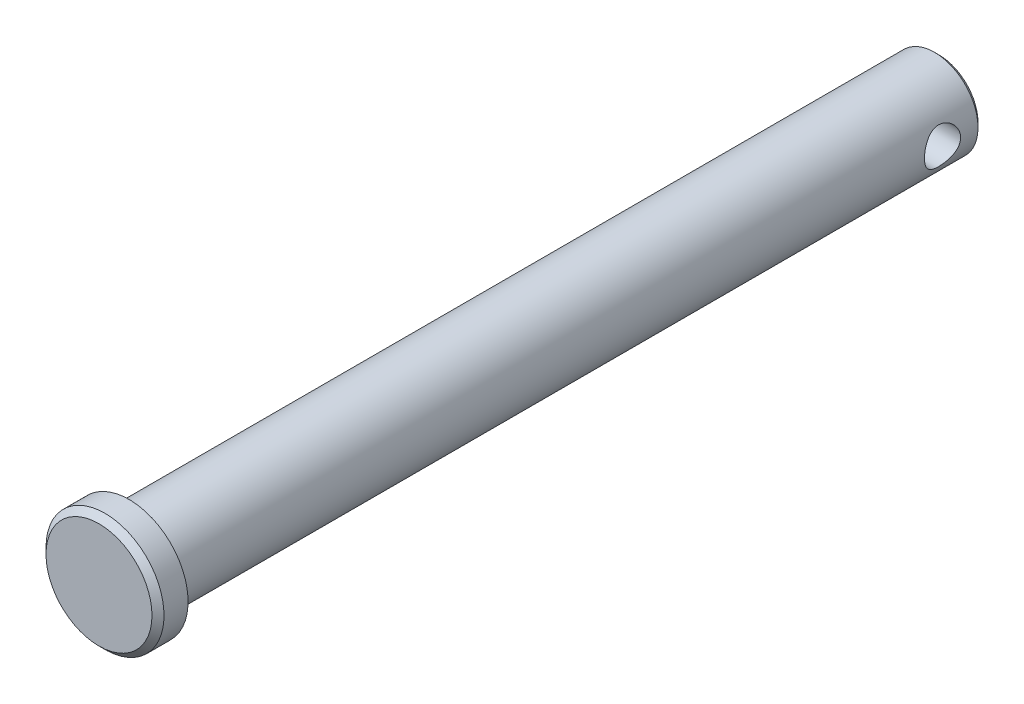
ISO-10303-21;
HEADER;
FILE_DESCRIPTION(('STEP AP214'),'2;1');
FILE_NAME('part.step','',(''),(''),'','','');
FILE_SCHEMA(('AUTOMOTIVE_DESIGN { 1 0 10303 214 1 1 1 1 }'));
ENDSEC;
DATA;
#1=APPLICATION_CONTEXT('core data for automotive mechanical design processes');
#2=APPLICATION_PROTOCOL_DEFINITION('international standard','automotive_design',2000,#1);
#3=PRODUCT_CONTEXT('',#1,'mechanical');
#4=PRODUCT('Part','Part','',(#3));
#5=PRODUCT_RELATED_PRODUCT_CATEGORY('part','',(#4));
#6=PRODUCT_DEFINITION_FORMATION('','',#4);
#7=PRODUCT_DEFINITION_CONTEXT('part definition',#1,'design');
#8=PRODUCT_DEFINITION('design','',#6,#7);
#9=PRODUCT_DEFINITION_SHAPE('','',#8);
#10=(LENGTH_UNIT() NAMED_UNIT(*) SI_UNIT(.MILLI.,.METRE.));
#11=(NAMED_UNIT(*) PLANE_ANGLE_UNIT() SI_UNIT($,.RADIAN.));
#12=(NAMED_UNIT(*) SI_UNIT($,.STERADIAN.) SOLID_ANGLE_UNIT());
#13=UNCERTAINTY_MEASURE_WITH_UNIT(LENGTH_MEASURE(1.E-05),#10,'distance_accuracy_value','');
#14=(GEOMETRIC_REPRESENTATION_CONTEXT(3) GLOBAL_UNCERTAINTY_ASSIGNED_CONTEXT((#13)) GLOBAL_UNIT_ASSIGNED_CONTEXT((#10,
#11,#12)) REPRESENTATION_CONTEXT('',''));
#15=CARTESIAN_POINT('',(0.,0.,0.));
#16=DIRECTION('',(0.,0.,1.));
#17=DIRECTION('',(1.,0.,0.));
#18=AXIS2_PLACEMENT_3D('',#15,#16,#17);
#19=CARTESIAN_POINT('',(0.,0.,44.45));
#20=DIRECTION('',(0.,0.,-1.));
#21=DIRECTION('',(-1.,0.,0.));
#22=AXIS2_PLACEMENT_3D('',#19,#20,#21);
#23=CYLINDRICAL_SURFACE('',#22,4.7625);
#24=CARTESIAN_POINT('',(0.,0.,-43.97375));
#25=DIRECTION('',(0.,0.,1.));
#26=DIRECTION('',(1.,0.,0.));
#27=AXIS2_PLACEMENT_3D('',#24,#25,#26);
#28=CIRCLE('',#27,4.7625);
#29=CARTESIAN_POINT('',(4.7625,0.,-43.97375));
#30=VERTEX_POINT('',#29);
#31=EDGE_CURVE('E40',#30,#30,#28,.T.);
#32=ORIENTED_EDGE('',*,*,#31,.T.);
#33=EDGE_LOOP('',(#32));
#34=FACE_BOUND('',#33,.T.);
#35=CARTESIAN_POINT('',(-4.7625,0.,-38.1));
#36=CARTESIAN_POINT('',(-4.76249140158045,-0.106295908560073,-38.1000114380824));
#37=CARTESIAN_POINT('',(-4.75890007347352,-0.212758967838845,-38.1085914841634));
#38=CARTESIAN_POINT('',(-4.74488118807538,-0.422667701710699,-38.1426070155608));
#39=CARTESIAN_POINT('',(-4.73443579242881,-0.526104765072408,-38.168086485087));
#40=CARTESIAN_POINT('',(-4.70783108848027,-0.726580864674278,-38.2347963582017));
#41=CARTESIAN_POINT('',(-4.69169114960318,-0.823640282526702,-38.2759734057807));
#42=CARTESIAN_POINT('',(-4.65526892272179,-1.00937973872919,-38.3726893568817));
#43=CARTESIAN_POINT('',(-4.63498788984898,-1.0980623041503,-38.4282239101163));
#44=CARTESIAN_POINT('',(-4.59117427508592,-1.26912434065072,-38.555023509863));
#45=CARTESIAN_POINT('',(-4.56753520905172,-1.35102801218446,-38.6268933277037));
#46=CARTESIAN_POINT('',(-4.52013183583765,-1.50202871598238,-38.7830446314673));
#47=CARTESIAN_POINT('',(-4.4963674694456,-1.57111900525552,-38.86733261077));
#48=CARTESIAN_POINT('',(-4.4500962212813,-1.69789058594091,-39.0509550093843));
#49=CARTESIAN_POINT('',(-4.42770874161498,-1.75484326694355,-39.1508256993771));
#50=CARTESIAN_POINT('',(-4.38841471116746,-1.85092880684824,-39.3597975469495));
#51=CARTESIAN_POINT('',(-4.37150533813807,-1.89007084577611,-39.4688939149316));
#52=CARTESIAN_POINT('',(-4.34623456677982,-1.94745924820552,-39.6877439856816));
#53=CARTESIAN_POINT('',(-4.33750065397212,-1.96662131880699,-39.7972128923851));
#54=CARTESIAN_POINT('',(-4.32849855373462,-1.98636270823876,-40.0181338521399));
#55=CARTESIAN_POINT('',(-4.328225697501,-1.98695227536355,-40.1295847775409));
#56=CARTESIAN_POINT('',(-4.33586127302854,-1.97022164952332,-40.3421850959405));
#57=CARTESIAN_POINT('',(-4.34314413823751,-1.95427093765777,-40.4434692407961));
#58=CARTESIAN_POINT('',(-4.36401341403402,-1.90720965737545,-40.6417654444631));
#59=CARTESIAN_POINT('',(-4.37760103179408,-1.87609618568393,-40.7387766812432));
#60=CARTESIAN_POINT('',(-4.40985568326751,-1.79898609480018,-40.9282228534989));
#61=CARTESIAN_POINT('',(-4.42862465094254,-1.75268686068537,-41.0205164807));
#62=CARTESIAN_POINT('',(-4.46910350686474,-1.64673347596642,-41.1963834025347));
#63=CARTESIAN_POINT('',(-4.49081455356025,-1.58707405869977,-41.279953239099));
#64=CARTESIAN_POINT('',(-4.53696350793792,-1.45017484530084,-41.4434336844884));
#65=CARTESIAN_POINT('',(-4.561476802296,-1.37187540459195,-41.5224381757244));
#66=CARTESIAN_POINT('',(-4.6089200606614,-1.20289572579427,-41.6664989359477));
#67=CARTESIAN_POINT('',(-4.63184965292253,-1.11221259562442,-41.7315519375613));
#68=CARTESIAN_POINT('',(-4.67420775145901,-0.918286118550733,-41.8471918699908));
#69=CARTESIAN_POINT('',(-4.69354323137542,-0.814801174635689,-41.8974102441767));
#70=CARTESIAN_POINT('',(-4.72582051746,-0.59984068901134,-41.9794073091202));
#71=CARTESIAN_POINT('',(-4.73876585655208,-0.488369601737113,-42.0111961907108));
#72=CARTESIAN_POINT('',(-4.75614430383386,-0.268173379937133,-42.053535387501));
#73=CARTESIAN_POINT('',(-4.76106396412311,-0.159720415379836,-42.065301723692));
#74=CARTESIAN_POINT('',(-4.76338979960382,0.0577130156000446,-42.0708871299874));
#75=CARTESIAN_POINT('',(-4.76079813192703,0.166693321604812,-42.064711352775));
#76=CARTESIAN_POINT('',(-4.74870808030392,0.37639345971703,-42.0354584028704));
#77=CARTESIAN_POINT('',(-4.73955883563333,0.477254834540027,-42.0132351978707));
#78=CARTESIAN_POINT('',(-4.71564663251208,0.673707613991607,-41.9537067411665));
#79=CARTESIAN_POINT('',(-4.70088296486029,0.769298351097898,-41.9163995840539));
#80=CARTESIAN_POINT('',(-4.666587546492,0.955848037292255,-41.826543576057));
#81=CARTESIAN_POINT('',(-4.64692192707484,1.04657086350783,-41.7735572592557));
#82=CARTESIAN_POINT('',(-4.60492164769306,1.21816211826739,-41.6543277627557));
#83=CARTESIAN_POINT('',(-4.58258587495364,1.29902640975558,-41.5880790481973));
#84=CARTESIAN_POINT('',(-4.53567939534007,1.45467932056039,-41.4386661171801));
#85=CARTESIAN_POINT('',(-4.51106304400759,1.52862073304299,-41.3546313765093));
#86=CARTESIAN_POINT('',(-4.46380134619208,1.66158838069249,-41.1749537244526));
#87=CARTESIAN_POINT('',(-4.44115644808334,1.72061122865917,-41.0793081841649));
#88=CARTESIAN_POINT('',(-4.40025450662331,1.8227033683131,-40.8771499967072));
#89=CARTESIAN_POINT('',(-4.3820645555624,1.86553345201759,-40.7705019686202));
#90=CARTESIAN_POINT('',(-4.35305764608595,1.93226394648122,-40.5505116823265));
#91=CARTESIAN_POINT('',(-4.34223460919756,1.95617996596104,-40.4371750270577));
#92=CARTESIAN_POINT('',(-4.33011523702907,1.98285227553879,-40.2164253150213));
#93=CARTESIAN_POINT('',(-4.32814969660371,1.98709566405842,-40.1092278486105));
#94=CARTESIAN_POINT('',(-4.33218991655001,1.9782722614421,-39.8957119579385));
#95=CARTESIAN_POINT('',(-4.33819445320237,1.96520812768995,-39.789393401252));
#96=CARTESIAN_POINT('',(-4.3568866269235,1.92338967589029,-39.5857527633931));
#97=CARTESIAN_POINT('',(-4.36925013318788,1.89539409419702,-39.4882422808769));
#98=CARTESIAN_POINT('',(-4.39901300153713,1.82524921020888,-39.2992800160954));
#99=CARTESIAN_POINT('',(-4.41641377846563,1.78309593083637,-39.2078299449294));
#100=CARTESIAN_POINT('',(-4.45558790364021,1.68291328922589,-39.0275827651808));
#101=CARTESIAN_POINT('',(-4.47756125557966,1.62408172945392,-38.9392758008578));
#102=CARTESIAN_POINT('',(-4.5228460637297,1.49333596530074,-38.7733220287649));
#103=CARTESIAN_POINT('',(-4.54615798199076,1.42141722463767,-38.6956789337341));
#104=CARTESIAN_POINT('',(-4.59353273649544,1.26031949767388,-38.5474389678255));
#105=CARTESIAN_POINT('',(-4.61752660299969,1.17026489966908,-38.4777671628655));
#106=CARTESIAN_POINT('',(-4.66185477999957,0.978852625814453,-38.3544771174995));
#107=CARTESIAN_POINT('',(-4.68218742117825,0.877489827988869,-38.3008661926128));
#108=CARTESIAN_POINT('',(-4.71660828587906,0.667912140039742,-38.2123793703642));
#109=CARTESIAN_POINT('',(-4.73079417348867,0.559838210681756,-38.177208432995));
#110=CARTESIAN_POINT('',(-4.75172103007692,0.33878904468141,-38.1258662025889));
#111=CARTESIAN_POINT('',(-4.75848530476497,0.225830315707268,-38.1096354224838));
#112=CARTESIAN_POINT('',(-4.76206006515682,0.074987280046702,-38.1010586067753));
#113=CARTESIAN_POINT('',(-4.76250303375275,0.0375040440476048,-38.0999959643381));
#114=CARTESIAN_POINT('',(-4.7625,0.,-38.1));
#115=B_SPLINE_CURVE_WITH_KNOTS('',3,(#35,#36,#37,#38,#39,#40,#41,#42,#43,#44,#45,#46,#47,#48,
#49,#50,#51,#52,#53,#54,#55,#56,#57,#58,#59,#60,#61,#62,#63,#64,#65,#66,#67,#68,#69,#70,#71,#72,
#73,#74,#75,#76,#77,#78,#79,#80,#81,#82,#83,#84,#85,#86,#87,#88,#89,#90,#91,#92,#93,#94,#95,#96,
#97,#98,#99,#100,#101,#102,#103,#104,#105,#106,#107,#108,#109,#110,#111,#112,#113,#114),
.UNSPECIFIED.,.T.,.F.,(4,2,2,2,2,2,2,2,2,2,2,2,2,2,2,2,2,2,2,2,2,2,2,2,2,2,2,2,2,2,2,2,2,2,2,2,
2,2,2,4),(0.,0.318780983728251,0.638394933248055,0.956932064901255,1.2753727935041,
1.60842223858481,1.94164645533701,2.2912661270586,2.64070539184808,2.97331246105872,
3.30573599470361,3.61267624559059,3.9196752906695,4.23320706980709,4.54686266326065,
4.88702574040535,5.22726839536908,5.57536437409041,5.92326768446546,6.24916903886785,
6.5749768089541,6.88461586205457,7.19429404105333,7.51359202244555,7.83302353682824,
8.17528349746504,8.51762109719041,8.86483476520742,9.21176159730895,9.53198305625933,
9.85215535434837,10.1574226931906,10.462775857341,10.7864893076844,11.1103151781368,
11.4577262432026,11.8052953096787,12.1471190861327,12.4878663512005,12.6003408219232),.UNSPECIFIED.);
#116=CARTESIAN_POINT('',(-4.7625,0.,-38.1));
#117=VERTEX_POINT('',#116);
#118=EDGE_CURVE('E51',#117,#117,#115,.T.);
#119=ORIENTED_EDGE('',*,*,#118,.T.);
#120=EDGE_LOOP('',(#119));
#121=FACE_BOUND('',#120,.T.);
#122=CARTESIAN_POINT('',(4.7625,0.,-42.06875));
#123=CARTESIAN_POINT('',(4.76249140158045,-0.106295908560074,-42.0687385619176));
#124=CARTESIAN_POINT('',(4.75890007347352,-0.212758967838847,-42.0601585158366));
#125=CARTESIAN_POINT('',(4.74488118807538,-0.4226677017107,-42.0261429844392));
#126=CARTESIAN_POINT('',(4.73443579242881,-0.526104765072408,-42.000663514913));
#127=CARTESIAN_POINT('',(4.70783108848027,-0.726580864674276,-41.9339536417983));
#128=CARTESIAN_POINT('',(4.69169114960318,-0.8236402825267,-41.8927765942193));
#129=CARTESIAN_POINT('',(4.65526892272179,-1.00937973872918,-41.7960606431183));
#130=CARTESIAN_POINT('',(4.63498788984898,-1.0980623041503,-41.7405260898838));
#131=CARTESIAN_POINT('',(4.59117427508592,-1.26912434065072,-41.613726490137));
#132=CARTESIAN_POINT('',(4.56753520905172,-1.35102801218446,-41.5418566722963));
#133=CARTESIAN_POINT('',(4.52013183583765,-1.50202871598238,-41.3857053685327));
#134=CARTESIAN_POINT('',(4.4963674694456,-1.57111900525552,-41.30141738923));
#135=CARTESIAN_POINT('',(4.4500962212813,-1.69789058594091,-41.1177949906157));
#136=CARTESIAN_POINT('',(4.42770874161498,-1.75484326694355,-41.0179243006229));
#137=CARTESIAN_POINT('',(4.38841471116746,-1.85092880684824,-40.8089524530505));
#138=CARTESIAN_POINT('',(4.37150533813807,-1.89007084577611,-40.6998560850684));
#139=CARTESIAN_POINT('',(4.34623456677982,-1.94745924820552,-40.4810060143184));
#140=CARTESIAN_POINT('',(4.33750065397212,-1.96662131880698,-40.371537107615));
#141=CARTESIAN_POINT('',(4.32849855373462,-1.98636270823876,-40.1506161478601));
#142=CARTESIAN_POINT('',(4.328225697501,-1.98695227536355,-40.0391652224591));
#143=CARTESIAN_POINT('',(4.33586127302854,-1.97022164952332,-39.8265649040595));
#144=CARTESIAN_POINT('',(4.34314413823751,-1.95427093765777,-39.7252807592039));
#145=CARTESIAN_POINT('',(4.36401341403402,-1.90720965737545,-39.5269845555369));
#146=CARTESIAN_POINT('',(4.37760103179408,-1.87609618568393,-39.4299733187568));
#147=CARTESIAN_POINT('',(4.40985568326751,-1.79898609480018,-39.2405271465011));
#148=CARTESIAN_POINT('',(4.42862465094254,-1.75268686068537,-39.1482335193));
#149=CARTESIAN_POINT('',(4.46910350686474,-1.64673347596642,-38.9723665974653));
#150=CARTESIAN_POINT('',(4.49081455356025,-1.58707405869977,-38.888796760901));
#151=CARTESIAN_POINT('',(4.53696350793792,-1.45017484530084,-38.7253163155116));
#152=CARTESIAN_POINT('',(4.561476802296,-1.37187540459195,-38.6463118242756));
#153=CARTESIAN_POINT('',(4.6089200606614,-1.20289572579427,-38.5022510640523));
#154=CARTESIAN_POINT('',(4.63184965292253,-1.11221259562442,-38.4371980624387));
#155=CARTESIAN_POINT('',(4.67420775145901,-0.918286118550733,-38.3215581300092));
#156=CARTESIAN_POINT('',(4.69354323137542,-0.814801174635689,-38.2713397558233));
#157=CARTESIAN_POINT('',(4.72582051746,-0.599840689011341,-38.1893426908798));
#158=CARTESIAN_POINT('',(4.73876585655208,-0.488369601737113,-38.1575538092892));
#159=CARTESIAN_POINT('',(4.75614430383386,-0.268173379937133,-38.115214612499));
#160=CARTESIAN_POINT('',(4.76106396412311,-0.159720415379836,-38.1034482763081));
#161=CARTESIAN_POINT('',(4.76338979960382,0.0577130156000439,-38.0978628700126));
#162=CARTESIAN_POINT('',(4.76079813192703,0.166693321604811,-38.104038647225));
#163=CARTESIAN_POINT('',(4.74870808030392,0.376393459717029,-38.1332915971296));
#164=CARTESIAN_POINT('',(4.73955883563333,0.477254834540026,-38.1555148021293));
#165=CARTESIAN_POINT('',(4.71564663251208,0.673707613991606,-38.2150432588335));
#166=CARTESIAN_POINT('',(4.7008829648603,0.769298351097898,-38.2523504159461));
#167=CARTESIAN_POINT('',(4.666587546492,0.955848037292255,-38.342206423943));
#168=CARTESIAN_POINT('',(4.64692192707484,1.04657086350783,-38.3951927407443));
#169=CARTESIAN_POINT('',(4.60492164769306,1.21816211826739,-38.5144222372443));
#170=CARTESIAN_POINT('',(4.58258587495364,1.29902640975558,-38.5806709518027));
#171=CARTESIAN_POINT('',(4.53567939534007,1.45467932056039,-38.73008388282));
#172=CARTESIAN_POINT('',(4.51106304400759,1.52862073304299,-38.8141186234907));
#173=CARTESIAN_POINT('',(4.46380134619208,1.66158838069249,-38.9937962755475));
#174=CARTESIAN_POINT('',(4.44115644808334,1.72061122865917,-39.0894418158351));
#175=CARTESIAN_POINT('',(4.40025450662331,1.8227033683131,-39.2916000032928));
#176=CARTESIAN_POINT('',(4.3820645555624,1.86553345201759,-39.3982480313798));
#177=CARTESIAN_POINT('',(4.35305764608595,1.93226394648122,-39.6182383176735));
#178=CARTESIAN_POINT('',(4.34223460919756,1.95617996596104,-39.7315749729423));
#179=CARTESIAN_POINT('',(4.33011523702907,1.98285227553879,-39.9523246849787));
#180=CARTESIAN_POINT('',(4.32814969660371,1.98709566405842,-40.0595221513895));
#181=CARTESIAN_POINT('',(4.33218991655001,1.9782722614421,-40.2730380420615));
#182=CARTESIAN_POINT('',(4.33819445320237,1.96520812768995,-40.379356598748));
#183=CARTESIAN_POINT('',(4.3568866269235,1.92338967589029,-40.5829972366069));
#184=CARTESIAN_POINT('',(4.36925013318788,1.89539409419702,-40.6805077191231));
#185=CARTESIAN_POINT('',(4.39901300153713,1.82524921020888,-40.8694699839046));
#186=CARTESIAN_POINT('',(4.41641377846563,1.78309593083637,-40.9609200550706));
#187=CARTESIAN_POINT('',(4.45558790364021,1.68291328922589,-41.1411672348192));
#188=CARTESIAN_POINT('',(4.47756125557966,1.62408172945392,-41.2294741991422));
#189=CARTESIAN_POINT('',(4.5228460637297,1.49333596530074,-41.3954279712351));
#190=CARTESIAN_POINT('',(4.54615798199076,1.42141722463767,-41.4730710662659));
#191=CARTESIAN_POINT('',(4.59353273649544,1.26031949767387,-41.6213110321745));
#192=CARTESIAN_POINT('',(4.61752660299969,1.17026489966908,-41.6909828371345));
#193=CARTESIAN_POINT('',(4.66185477999957,0.978852625814449,-41.8142728825005));
#194=CARTESIAN_POINT('',(4.68218742117825,0.877489827988869,-41.8678838073872));
#195=CARTESIAN_POINT('',(4.71660828587906,0.667912140039744,-41.9563706296358));
#196=CARTESIAN_POINT('',(4.73079417348868,0.559838210681756,-41.991541567005));
#197=CARTESIAN_POINT('',(4.75172103007692,0.338789044681409,-42.0428837974111));
#198=CARTESIAN_POINT('',(4.75848530476497,0.225830315707268,-42.0591145775162));
#199=CARTESIAN_POINT('',(4.76206006515682,0.0749872800467027,-42.0676913932247));
#200=CARTESIAN_POINT('',(4.76250303375275,0.0375040440476052,-42.0687540356619));
#201=CARTESIAN_POINT('',(4.7625,0.,-42.06875));
#202=B_SPLINE_CURVE_WITH_KNOTS('',3,(#122,#123,#124,#125,#126,#127,#128,#129,#130,#131,#132,
#133,#134,#135,#136,#137,#138,#139,#140,#141,#142,#143,#144,#145,#146,#147,#148,#149,#150,#151,
#152,#153,#154,#155,#156,#157,#158,#159,#160,#161,#162,#163,#164,#165,#166,#167,#168,#169,#170,
#171,#172,#173,#174,#175,#176,#177,#178,#179,#180,#181,#182,#183,#184,#185,#186,#187,#188,#189,
#190,#191,#192,#193,#194,#195,#196,#197,#198,#199,#200,#201),.UNSPECIFIED.,.T.,.F.,(4,2,2,2,2,2,
2,2,2,2,2,2,2,2,2,2,2,2,2,2,2,2,2,2,2,2,2,2,2,2,2,2,2,2,2,2,2,2,2,4),(0.,0.318780983728252,
0.638394933248055,0.956932064901252,1.2753727935041,1.60842223858481,1.94164645533701,
2.2912661270586,2.64070539184808,2.97331246105871,3.3057359947036,3.61267624559059,
3.9196752906695,4.23320706980709,4.54686266326065,4.88702574040535,5.22726839536908,
5.57536437409041,5.92326768446546,6.24916903886785,6.57497680895409,6.88461586205457,
7.19429404105333,7.51359202244555,7.83302353682824,8.17528349746504,8.51762109719041,
8.86483476520742,9.21176159730895,9.53198305625933,9.85215535434837,10.1574226931906,
10.462775857341,10.7864893076844,11.1103151781368,11.4577262432026,11.8052953096787,
12.1471190861327,12.4878663512005,12.6003408219232),.UNSPECIFIED.);
#203=CARTESIAN_POINT('',(4.7625,0.,-42.06875));
#204=VERTEX_POINT('',#203);
#205=EDGE_CURVE('E59',#204,#204,#202,.T.);
#206=ORIENTED_EDGE('',*,*,#205,.T.);
#207=EDGE_LOOP('',(#206));
#208=FACE_BOUND('',#207,.T.);
#209=CARTESIAN_POINT('',(0.,0.,44.45));
#210=DIRECTION('',(0.,0.,1.));
#211=DIRECTION('',(1.,0.,0.));
#212=AXIS2_PLACEMENT_3D('',#209,#210,#211);
#213=CIRCLE('',#212,4.7625);
#214=CARTESIAN_POINT('',(4.7625,0.,44.45));
#215=VERTEX_POINT('',#214);
#216=EDGE_CURVE('E97',#215,#215,#213,.T.);
#217=ORIENTED_EDGE('',*,*,#216,.F.);
#218=EDGE_LOOP('',(#217));
#219=FACE_BOUND('',#218,.T.);
#220=ADVANCED_FACE('F33',(#34,#121,#208,#219),#23,.T.);
#221=CARTESIAN_POINT('',(0.,0.,-44.45));
#222=DIRECTION('',(0.,0.,1.));
#223=DIRECTION('',(1.,0.,0.));
#224=AXIS2_PLACEMENT_3D('',#221,#222,#223);
#225=PLANE('',#224);
#226=CARTESIAN_POINT('',(0.,0.,-44.45));
#227=DIRECTION('',(0.,0.,1.));
#228=DIRECTION('',(1.,0.,0.));
#229=AXIS2_PLACEMENT_3D('',#226,#227,#228);
#230=CIRCLE('',#229,4.28625000000004);
#231=CARTESIAN_POINT('',(4.28625000000004,0.,-44.45));
#232=VERTEX_POINT('',#231);
#233=EDGE_CURVE('E10',#232,#232,#230,.F.);
#234=ORIENTED_EDGE('',*,*,#233,.T.);
#235=EDGE_LOOP('',(#234));
#236=FACE_BOUND('',#235,.T.);
#237=ADVANCED_FACE('F79',(#236),#225,.F.);
#238=CARTESIAN_POINT('',(0.,0.,44.45));
#239=DIRECTION('',(0.,0.,1.));
#240=DIRECTION('',(1.,0.,0.));
#241=AXIS2_PLACEMENT_3D('',#238,#239,#240);
#242=PLANE('',#241);
#243=CARTESIAN_POINT('',(0.,0.,44.45));
#244=DIRECTION('',(0.,0.,1.));
#245=DIRECTION('',(1.,0.,0.));
#246=AXIS2_PLACEMENT_3D('',#243,#244,#245);
#247=CIRCLE('',#246,6.477);
#248=CARTESIAN_POINT('',(-6.477,0.,44.45));
#249=VERTEX_POINT('',#248);
#250=EDGE_CURVE('E58',#249,#249,#247,.T.);
#251=ORIENTED_EDGE('',*,*,#250,.F.);
#252=EDGE_LOOP('',(#251));
#253=FACE_BOUND('',#252,.T.);
#254=ORIENTED_EDGE('',*,*,#216,.T.);
#255=EDGE_LOOP('',(#254));
#256=FACE_BOUND('',#255,.T.);
#257=ADVANCED_FACE('F76',(#253,#256),#242,.F.);
#258=CARTESIAN_POINT('',(0.,0.,47.752));
#259=DIRECTION('',(0.,0.,-1.));
#260=DIRECTION('',(-1.,0.,0.));
#261=AXIS2_PLACEMENT_3D('',#258,#259,#260);
#262=CYLINDRICAL_SURFACE('',#261,6.477);
#263=CARTESIAN_POINT('',(0.,0.,47.0916));
#264=DIRECTION('',(0.,0.,1.));
#265=DIRECTION('',(1.,0.,0.));
#266=AXIS2_PLACEMENT_3D('',#263,#264,#265);
#267=CIRCLE('',#266,6.477);
#268=CARTESIAN_POINT('',(-6.477,0.,47.0916));
#269=VERTEX_POINT('',#268);
#270=EDGE_CURVE('E44',#269,#269,#267,.F.);
#271=CARTESIAN_POINT('',(-6.477,0.,47.0916));
#272=CARTESIAN_POINT('',(-6.477,0.,47.0640833333334));
#273=CARTESIAN_POINT('',(-6.477,0.,47.0365666666667));
#274=CARTESIAN_POINT('',(-6.477,0.,46.9815333333334));
#275=CARTESIAN_POINT('',(-6.477,0.,46.9540166666667));
#276=CARTESIAN_POINT('',(-6.477,0.,46.8989833333334));
#277=CARTESIAN_POINT('',(-6.477,0.,46.8714666666667));
#278=CARTESIAN_POINT('',(-6.477,0.,46.8164333333334));
#279=CARTESIAN_POINT('',(-6.477,0.,46.7889166666667));
#280=CARTESIAN_POINT('',(-6.477,0.,46.7338833333334));
#281=CARTESIAN_POINT('',(-6.477,0.,46.7063666666667));
#282=CARTESIAN_POINT('',(-6.477,0.,46.6513333333334));
#283=CARTESIAN_POINT('',(-6.477,0.,46.6238166666667));
#284=CARTESIAN_POINT('',(-6.477,0.,46.5687833333334));
#285=CARTESIAN_POINT('',(-6.477,0.,46.5412666666667));
#286=CARTESIAN_POINT('',(-6.477,0.,46.4862333333334));
#287=CARTESIAN_POINT('',(-6.477,0.,46.4587166666667));
#288=CARTESIAN_POINT('',(-6.477,0.,46.4036833333334));
#289=CARTESIAN_POINT('',(-6.477,0.,46.3761666666667));
#290=CARTESIAN_POINT('',(-6.477,0.,46.3211333333334));
#291=CARTESIAN_POINT('',(-6.477,0.,46.2936166666667));
#292=CARTESIAN_POINT('',(-6.477,0.,46.2385833333334));
#293=CARTESIAN_POINT('',(-6.477,0.,46.2110666666667));
#294=CARTESIAN_POINT('',(-6.477,0.,46.1560333333334));
#295=CARTESIAN_POINT('',(-6.477,0.,46.1285166666667));
#296=CARTESIAN_POINT('',(-6.477,0.,46.0734833333333));
#297=CARTESIAN_POINT('',(-6.477,0.,46.0459666666667));
#298=CARTESIAN_POINT('',(-6.477,0.,45.9909333333334));
#299=CARTESIAN_POINT('',(-6.477,0.,45.9634166666667));
#300=CARTESIAN_POINT('',(-6.477,0.,45.9083833333334));
#301=CARTESIAN_POINT('',(-6.477,0.,45.8808666666667));
#302=CARTESIAN_POINT('',(-6.477,0.,45.8258333333333));
#303=CARTESIAN_POINT('',(-6.477,0.,45.7983166666667));
#304=CARTESIAN_POINT('',(-6.477,0.,45.7432833333334));
#305=CARTESIAN_POINT('',(-6.477,0.,45.7157666666667));
#306=CARTESIAN_POINT('',(-6.477,0.,45.6607333333333));
#307=CARTESIAN_POINT('',(-6.477,0.,45.6332166666667));
#308=CARTESIAN_POINT('',(-6.477,0.,45.5781833333333));
#309=CARTESIAN_POINT('',(-6.477,0.,45.5506666666667));
#310=CARTESIAN_POINT('',(-6.477,0.,45.4956333333333));
#311=CARTESIAN_POINT('',(-6.477,0.,45.4681166666667));
#312=CARTESIAN_POINT('',(-6.477,0.,45.4130833333333));
#313=CARTESIAN_POINT('',(-6.477,0.,45.3855666666667));
#314=CARTESIAN_POINT('',(-6.477,0.,45.3305333333333));
#315=CARTESIAN_POINT('',(-6.477,0.,45.3030166666667));
#316=CARTESIAN_POINT('',(-6.477,0.,45.2479833333333));
#317=CARTESIAN_POINT('',(-6.477,0.,45.2204666666667));
#318=CARTESIAN_POINT('',(-6.477,0.,45.1654333333333));
#319=CARTESIAN_POINT('',(-6.477,0.,45.1379166666667));
#320=CARTESIAN_POINT('',(-6.477,0.,45.0828833333333));
#321=CARTESIAN_POINT('',(-6.477,0.,45.0553666666667));
#322=CARTESIAN_POINT('',(-6.477,0.,45.0003333333333));
#323=CARTESIAN_POINT('',(-6.477,0.,44.9728166666667));
#324=CARTESIAN_POINT('',(-6.477,0.,44.9177833333333));
#325=CARTESIAN_POINT('',(-6.477,0.,44.8902666666667));
#326=CARTESIAN_POINT('',(-6.477,0.,44.8352333333333));
#327=CARTESIAN_POINT('',(-6.477,0.,44.8077166666667));
#328=CARTESIAN_POINT('',(-6.477,0.,44.7526833333333));
#329=CARTESIAN_POINT('',(-6.477,0.,44.7251666666667));
#330=CARTESIAN_POINT('',(-6.477,0.,44.6701333333333));
#331=CARTESIAN_POINT('',(-6.477,0.,44.6426166666667));
#332=CARTESIAN_POINT('',(-6.477,0.,44.5875833333333));
#333=CARTESIAN_POINT('',(-6.477,0.,44.5600666666667));
#334=CARTESIAN_POINT('',(-6.477,0.,44.5050333333333));
#335=CARTESIAN_POINT('',(-6.477,0.,44.4775166666667));
#336=CARTESIAN_POINT('',(-6.477,0.,44.45));
#337=B_SPLINE_CURVE_WITH_KNOTS('',3,(#271,#272,#273,#274,#275,#276,#277,#278,#279,#280,#281,
#282,#283,#284,#285,#286,#287,#288,#289,#290,#291,#292,#293,#294,#295,#296,#297,#298,#299,#300,
#301,#302,#303,#304,#305,#306,#307,#308,#309,#310,#311,#312,#313,#314,#315,#316,#317,#318,#319,
#320,#321,#322,#323,#324,#325,#326,#327,#328,#329,#330,#331,#332,#333,#334,#335,#336),
.UNSPECIFIED.,.F.,.F.,(4,2,2,2,2,2,2,2,2,2,2,2,2,2,2,2,2,2,2,2,2,2,2,2,2,2,2,2,2,2,2,2,4),(0.,
0.0825500000000007,0.165100000000001,0.247650000000002,0.330200000000003,0.412750000000003,
0.495300000000004,0.577850000000005,0.660400000000005,0.742950000000006,0.825500000000007,
0.908050000000014,0.990600000000015,1.07315000000002,1.15570000000002,1.23825000000002,
1.32080000000002,1.40335000000002,1.48590000000002,1.56845000000002,1.65100000000002,
1.73355000000002,1.81610000000003,1.89865000000003,1.98120000000003,2.06375000000003,
2.14630000000003,2.22885000000003,2.31140000000003,2.39395000000003,2.47650000000003,
2.55905000000003,2.64160000000004),.UNSPECIFIED.);
#338=EDGE_CURVE('BSEAM74',#269,#249,#337,.T.);
#339=ORIENTED_EDGE('',*,*,#270,.T.);
#340=ORIENTED_EDGE('',*,*,#250,.T.);
#341=ORIENTED_EDGE('',*,*,#338,.T.);
#342=ORIENTED_EDGE('',*,*,#338,.F.);
#343=EDGE_LOOP('',(#339,#341,#340,#342));
#344=FACE_BOUND('',#343,.T.);
#345=ADVANCED_FACE('F74',(#344),#262,.T.);
#346=CARTESIAN_POINT('',(0.,0.,47.752));
#347=DIRECTION('',(0.,0.,1.));
#348=DIRECTION('',(1.,0.,0.));
#349=AXIS2_PLACEMENT_3D('',#346,#347,#348);
#350=PLANE('',#349);
#351=CARTESIAN_POINT('',(0.,0.,47.752));
#352=DIRECTION('',(0.,0.,1.));
#353=DIRECTION('',(1.,0.,0.));
#354=AXIS2_PLACEMENT_3D('',#351,#352,#353);
#355=CIRCLE('',#354,5.81660000000003);
#356=CARTESIAN_POINT('',(5.81660000000003,0.,47.752));
#357=VERTEX_POINT('',#356);
#358=EDGE_CURVE('E48',#357,#357,#355,.T.);
#359=ORIENTED_EDGE('',*,*,#358,.T.);
#360=EDGE_LOOP('',(#359));
#361=FACE_BOUND('',#360,.T.);
#362=ADVANCED_FACE('F70',(#361),#350,.T.);
#363=CARTESIAN_POINT('',(0.,0.,47.752));
#364=DIRECTION('',(0.,0.,-1.));
#365=DIRECTION('',(-1.,0.,0.));
#366=AXIS2_PLACEMENT_3D('',#363,#364,#365);
#367=CONICAL_SURFACE('',#366,5.81660000000003,0.785398163397457);
#368=ORIENTED_EDGE('',*,*,#270,.F.);
#369=EDGE_LOOP('',(#368));
#370=FACE_BOUND('',#369,.T.);
#371=ORIENTED_EDGE('',*,*,#358,.F.);
#372=EDGE_LOOP('',(#371));
#373=FACE_BOUND('',#372,.T.);
#374=ADVANCED_FACE('F68',(#370,#373),#367,.T.);
#375=CARTESIAN_POINT('',(-6.477,0.,-40.084375));
#376=DIRECTION('',(1.,0.,0.));
#377=DIRECTION('',(0.,0.,-1.));
#378=AXIS2_PLACEMENT_3D('',#375,#376,#377);
#379=CYLINDRICAL_SURFACE('',#378,1.984375);
#380=ORIENTED_EDGE('',*,*,#205,.F.);
#381=EDGE_LOOP('',(#380));
#382=FACE_BOUND('',#381,.T.);
#383=ORIENTED_EDGE('',*,*,#118,.F.);
#384=EDGE_LOOP('',(#383));
#385=FACE_BOUND('',#384,.T.);
#386=ADVANCED_FACE('F64',(#382,#385),#379,.F.);
#387=CARTESIAN_POINT('',(0.,0.,-43.97375));
#388=DIRECTION('',(0.,0.,1.));
#389=DIRECTION('',(1.,0.,0.));
#390=AXIS2_PLACEMENT_3D('',#387,#388,#389);
#391=CONICAL_SURFACE('',#390,4.7625,0.785398163397438);
#392=ORIENTED_EDGE('',*,*,#233,.F.);
#393=EDGE_LOOP('',(#392));
#394=FACE_BOUND('',#393,.T.);
#395=ORIENTED_EDGE('',*,*,#31,.F.);
#396=EDGE_LOOP('',(#395));
#397=FACE_BOUND('',#396,.T.);
#398=ADVANCED_FACE('F35',(#394,#397),#391,.T.);
#399=CLOSED_SHELL('',(#220,#237,#257,#345,#362,#374,#386,#398));
#400=MANIFOLD_SOLID_BREP('B2',#399);
#401=ADVANCED_BREP_SHAPE_REPRESENTATION('',(#18,#400),#14);
#402=SHAPE_DEFINITION_REPRESENTATION(#9,#401);
ENDSEC;
END-ISO-10303-21;
